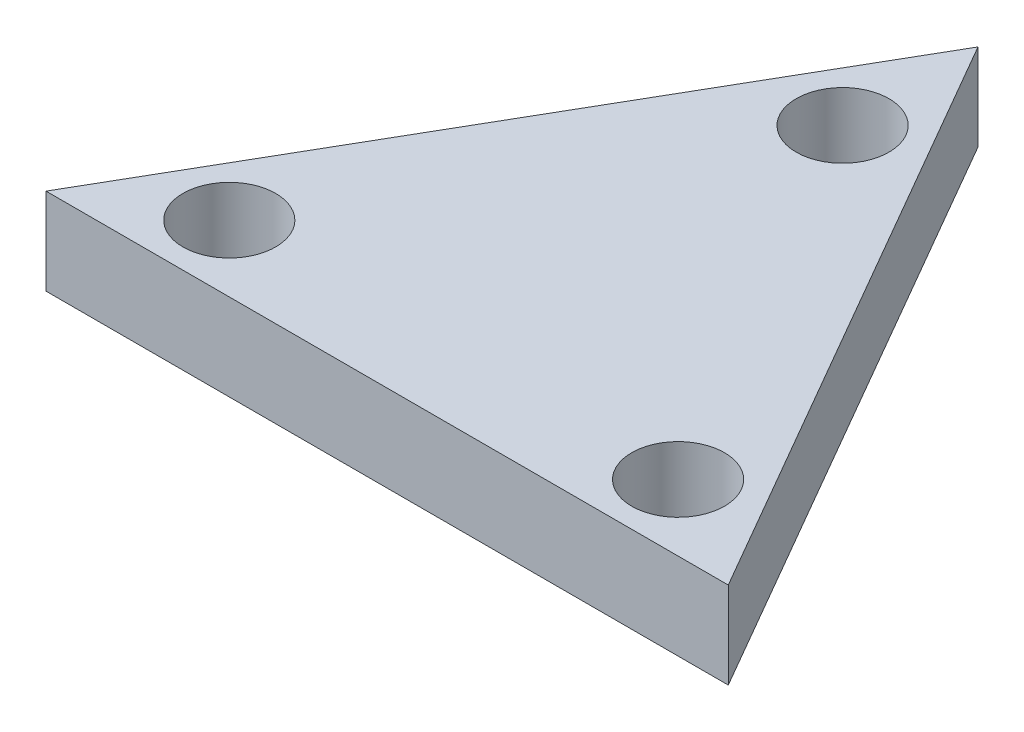
ISO-10303-21;
HEADER;
FILE_DESCRIPTION(('STEP AP214'),'2;1');
FILE_NAME('part.step','',(''),(''),'','','');
FILE_SCHEMA(('AUTOMOTIVE_DESIGN { 1 0 10303 214 1 1 1 1 }'));
ENDSEC;
DATA;
#1=APPLICATION_CONTEXT('core data for automotive mechanical design processes');
#2=APPLICATION_PROTOCOL_DEFINITION('international standard','automotive_design',2000,#1);
#3=PRODUCT_CONTEXT('',#1,'mechanical');
#4=PRODUCT('Part','Part','',(#3));
#5=PRODUCT_RELATED_PRODUCT_CATEGORY('part','',(#4));
#6=PRODUCT_DEFINITION_FORMATION('','',#4);
#7=PRODUCT_DEFINITION_CONTEXT('part definition',#1,'design');
#8=PRODUCT_DEFINITION('design','',#6,#7);
#9=PRODUCT_DEFINITION_SHAPE('','',#8);
#10=(LENGTH_UNIT() NAMED_UNIT(*) SI_UNIT(.MILLI.,.METRE.));
#11=(NAMED_UNIT(*) PLANE_ANGLE_UNIT() SI_UNIT($,.RADIAN.));
#12=(NAMED_UNIT(*) SI_UNIT($,.STERADIAN.) SOLID_ANGLE_UNIT());
#13=UNCERTAINTY_MEASURE_WITH_UNIT(LENGTH_MEASURE(1.E-05),#10,'distance_accuracy_value','');
#14=(GEOMETRIC_REPRESENTATION_CONTEXT(3) GLOBAL_UNCERTAINTY_ASSIGNED_CONTEXT((#13)) GLOBAL_UNIT_ASSIGNED_CONTEXT((#10,
#11,#12)) REPRESENTATION_CONTEXT('',''));
#15=CARTESIAN_POINT('',(0.,0.,0.));
#16=DIRECTION('',(0.,0.,1.));
#17=DIRECTION('',(1.,0.,0.));
#18=AXIS2_PLACEMENT_3D('',#15,#16,#17);
#19=CARTESIAN_POINT('',(12.4904092944218,3.175,6.34325313807528));
#20=DIRECTION('',(-0.866025403784439,0.,0.5));
#21=DIRECTION('',(0.5,0.,0.866025403784439));
#22=AXIS2_PLACEMENT_3D('',#19,#20,#21);
#23=PLANE('',#22);
#24=DIRECTION('',(-0.5,0.,-0.866025403784439));
#25=VECTOR('',#24,1.);
#26=CARTESIAN_POINT('',(12.4904092944218,0.,6.34325313807528));
#27=LINE('',#26,#25);
#28=CARTESIAN_POINT('',(12.4904092944218,0.,6.34325313807528));
#29=VERTEX_POINT('',#28);
#30=CARTESIAN_POINT('',(-0.00959070557821594,0.,-15.3073819565357));
#31=VERTEX_POINT('',#30);
#32=EDGE_CURVE('E88',#29,#31,#27,.T.);
#33=ORIENTED_EDGE('',*,*,#32,.T.);
#34=DIRECTION('',(0.,-1.,0.));
#35=VECTOR('',#34,1.);
#36=CARTESIAN_POINT('',(-0.00959070557821594,3.175,-15.3073819565357));
#37=LINE('',#36,#35);
#38=CARTESIAN_POINT('',(-0.00959070557821594,3.175,-15.3073819565357));
#39=VERTEX_POINT('',#38);
#40=EDGE_CURVE('E11',#39,#31,#37,.T.);
#41=ORIENTED_EDGE('',*,*,#40,.F.);
#42=DIRECTION('',(-0.5,0.,-0.866025403784439));
#43=VECTOR('',#42,1.);
#44=CARTESIAN_POINT('',(12.4904092944218,3.175,6.34325313807528));
#45=LINE('',#44,#43);
#46=CARTESIAN_POINT('',(12.4904092944218,3.175,6.34325313807528));
#47=VERTEX_POINT('',#46);
#48=EDGE_CURVE('E80',#47,#39,#45,.T.);
#49=ORIENTED_EDGE('',*,*,#48,.F.);
#50=DIRECTION('',(0.,-1.,0.));
#51=VECTOR('',#50,1.);
#52=CARTESIAN_POINT('',(12.4904092944218,3.175,6.34325313807528));
#53=LINE('',#52,#51);
#54=EDGE_CURVE('E89',#47,#29,#53,.T.);
#55=ORIENTED_EDGE('',*,*,#54,.T.);
#56=EDGE_LOOP('',(#33,#41,#49,#55));
#57=FACE_BOUND('',#56,.T.);
#58=ADVANCED_FACE('F38',(#57),#23,.F.);
#59=CARTESIAN_POINT('',(-0.00959070557821594,3.175,-15.3073819565357));
#60=DIRECTION('',(0.866025403784439,0.,0.5));
#61=DIRECTION('',(0.5,0.,-0.866025403784439));
#62=AXIS2_PLACEMENT_3D('',#59,#60,#61);
#63=PLANE('',#62);
#64=DIRECTION('',(-0.5,0.,0.866025403784439));
#65=VECTOR('',#64,1.);
#66=CARTESIAN_POINT('',(-0.00959070557821594,0.,-15.3073819565357));
#67=LINE('',#66,#65);
#68=CARTESIAN_POINT('',(-12.5095907055782,0.,6.34325313807528));
#69=VERTEX_POINT('',#68);
#70=EDGE_CURVE('E67',#31,#69,#67,.T.);
#71=ORIENTED_EDGE('',*,*,#70,.T.);
#72=DIRECTION('',(0.,-1.,0.));
#73=VECTOR('',#72,1.);
#74=CARTESIAN_POINT('',(-12.5095907055782,3.175,6.34325313807528));
#75=LINE('',#74,#73);
#76=CARTESIAN_POINT('',(-12.5095907055782,3.175,6.34325313807528));
#77=VERTEX_POINT('',#76);
#78=EDGE_CURVE('E47',#77,#69,#75,.T.);
#79=ORIENTED_EDGE('',*,*,#78,.F.);
#80=DIRECTION('',(-0.5,0.,0.866025403784439));
#81=VECTOR('',#80,1.);
#82=CARTESIAN_POINT('',(-0.00959070557821594,3.175,-15.3073819565357));
#83=LINE('',#82,#81);
#84=EDGE_CURVE('E75',#39,#77,#83,.T.);
#85=ORIENTED_EDGE('',*,*,#84,.F.);
#86=ORIENTED_EDGE('',*,*,#40,.T.);
#87=EDGE_LOOP('',(#71,#79,#85,#86));
#88=FACE_BOUND('',#87,.T.);
#89=ADVANCED_FACE('F76',(#88),#63,.F.);
#90=CARTESIAN_POINT('',(-12.5095907055782,3.175,6.34325313807528));
#91=DIRECTION('',(0.,0.,-1.));
#92=DIRECTION('',(-1.,0.,0.));
#93=AXIS2_PLACEMENT_3D('',#90,#91,#92);
#94=PLANE('',#93);
#95=DIRECTION('',(1.,0.,0.));
#96=VECTOR('',#95,1.);
#97=CARTESIAN_POINT('',(-12.5095907055782,0.,6.34325313807528));
#98=LINE('',#97,#96);
#99=EDGE_CURVE('E72',#69,#29,#98,.T.);
#100=ORIENTED_EDGE('',*,*,#99,.T.);
#101=ORIENTED_EDGE('',*,*,#54,.F.);
#102=DIRECTION('',(1.,0.,0.));
#103=VECTOR('',#102,1.);
#104=CARTESIAN_POINT('',(-12.5095907055782,3.175,6.34325313807528));
#105=LINE('',#104,#103);
#106=EDGE_CURVE('E55',#77,#47,#105,.T.);
#107=ORIENTED_EDGE('',*,*,#106,.F.);
#108=ORIENTED_EDGE('',*,*,#78,.T.);
#109=EDGE_LOOP('',(#100,#101,#107,#108));
#110=FACE_BOUND('',#109,.T.);
#111=ADVANCED_FACE('F106',(#110),#94,.F.);
#112=CARTESIAN_POINT('',(0.,3.175,0.));
#113=DIRECTION('',(0.,1.,0.));
#114=DIRECTION('',(0.,0.,1.));
#115=AXIS2_PLACEMENT_3D('',#112,#113,#114);
#116=PLANE('',#115);
#117=CARTESIAN_POINT('',(0.,3.175,-10.3362338651444));
#118=DIRECTION('',(0.,1.,0.));
#119=DIRECTION('',(0.,0.,1.));
#120=AXIS2_PLACEMENT_3D('',#117,#118,#119);
#121=CIRCLE('',#120,1.7);
#122=CARTESIAN_POINT('',(0.,3.175,-8.63623386514437));
#123=VERTEX_POINT('',#122);
#124=EDGE_CURVE('E98',#123,#123,#121,.T.);
#125=ORIENTED_EDGE('',*,*,#124,.F.);
#126=EDGE_LOOP('',(#125));
#127=FACE_BOUND('',#126,.T.);
#128=CARTESIAN_POINT('',(-8.22876437327352,3.175,3.90771000195734));
#129=DIRECTION('',(0.,1.,0.));
#130=DIRECTION('',(0.,0.,1.));
#131=AXIS2_PLACEMENT_3D('',#128,#129,#130);
#132=CIRCLE('',#131,1.7);
#133=CARTESIAN_POINT('',(-8.22876437327352,3.175,5.60771000195734));
#134=VERTEX_POINT('',#133);
#135=EDGE_CURVE('E178',#134,#134,#132,.T.);
#136=ORIENTED_EDGE('',*,*,#135,.F.);
#137=EDGE_LOOP('',(#136));
#138=FACE_BOUND('',#137,.T.);
#139=CARTESIAN_POINT('',(8.22123505235288,3.175,3.91205705741768));
#140=DIRECTION('',(0.,1.,0.));
#141=DIRECTION('',(0.,0.,1.));
#142=AXIS2_PLACEMENT_3D('',#139,#140,#141);
#143=CIRCLE('',#142,1.7);
#144=CARTESIAN_POINT('',(8.22123505235288,3.175,5.61205705741768));
#145=VERTEX_POINT('',#144);
#146=EDGE_CURVE('E188',#145,#145,#143,.T.);
#147=ORIENTED_EDGE('',*,*,#146,.F.);
#148=EDGE_LOOP('',(#147));
#149=FACE_BOUND('',#148,.T.);
#150=ORIENTED_EDGE('',*,*,#48,.T.);
#151=ORIENTED_EDGE('',*,*,#84,.T.);
#152=ORIENTED_EDGE('',*,*,#106,.T.);
#153=EDGE_LOOP('',(#150,#151,#152));
#154=FACE_BOUND('',#153,.T.);
#155=ADVANCED_FACE('F83',(#127,#138,#149,#154),#116,.T.);
#156=CARTESIAN_POINT('',(0.,0.,0.));
#157=DIRECTION('',(0.,1.,0.));
#158=DIRECTION('',(0.,0.,1.));
#159=AXIS2_PLACEMENT_3D('',#156,#157,#158);
#160=PLANE('',#159);
#161=CARTESIAN_POINT('',(0.,0.,-10.3362338651444));
#162=DIRECTION('',(0.,1.,0.));
#163=DIRECTION('',(0.,0.,1.));
#164=AXIS2_PLACEMENT_3D('',#161,#162,#163);
#165=CIRCLE('',#164,1.7);
#166=CARTESIAN_POINT('',(0.,0.,-8.63623386514437));
#167=VERTEX_POINT('',#166);
#168=EDGE_CURVE('E92',#167,#167,#165,.T.);
#169=ORIENTED_EDGE('',*,*,#168,.T.);
#170=EDGE_LOOP('',(#169));
#171=FACE_BOUND('',#170,.T.);
#172=CARTESIAN_POINT('',(-8.22876437327352,0.,3.90771000195734));
#173=DIRECTION('',(0.,1.,0.));
#174=DIRECTION('',(0.,0.,1.));
#175=AXIS2_PLACEMENT_3D('',#172,#173,#174);
#176=CIRCLE('',#175,1.7);
#177=CARTESIAN_POINT('',(-8.22876437327352,0.,5.60771000195734));
#178=VERTEX_POINT('',#177);
#179=EDGE_CURVE('E174',#178,#178,#176,.T.);
#180=ORIENTED_EDGE('',*,*,#179,.T.);
#181=EDGE_LOOP('',(#180));
#182=FACE_BOUND('',#181,.T.);
#183=CARTESIAN_POINT('',(8.22123505235288,0.,3.91205705741768));
#184=DIRECTION('',(0.,1.,0.));
#185=DIRECTION('',(0.,0.,1.));
#186=AXIS2_PLACEMENT_3D('',#183,#184,#185);
#187=CIRCLE('',#186,1.7);
#188=CARTESIAN_POINT('',(8.22123505235288,0.,5.61205705741768));
#189=VERTEX_POINT('',#188);
#190=EDGE_CURVE('E184',#189,#189,#187,.T.);
#191=ORIENTED_EDGE('',*,*,#190,.T.);
#192=EDGE_LOOP('',(#191));
#193=FACE_BOUND('',#192,.T.);
#194=ORIENTED_EDGE('',*,*,#32,.F.);
#195=ORIENTED_EDGE('',*,*,#99,.F.);
#196=ORIENTED_EDGE('',*,*,#70,.F.);
#197=EDGE_LOOP('',(#194,#195,#196));
#198=FACE_BOUND('',#197,.T.);
#199=ADVANCED_FACE('F107',(#171,#182,#193,#198),#160,.F.);
#200=CARTESIAN_POINT('',(8.22123505235288,0.,3.91205705741768));
#201=DIRECTION('',(0.,1.,0.));
#202=DIRECTION('',(0.,0.,1.));
#203=AXIS2_PLACEMENT_3D('',#200,#201,#202);
#204=CYLINDRICAL_SURFACE('',#203,1.7);
#205=ORIENTED_EDGE('',*,*,#190,.F.);
#206=EDGE_LOOP('',(#205));
#207=FACE_BOUND('',#206,.T.);
#208=ORIENTED_EDGE('',*,*,#146,.T.);
#209=EDGE_LOOP('',(#208));
#210=FACE_BOUND('',#209,.T.);
#211=ADVANCED_FACE('F109',(#207,#210),#204,.F.);
#212=CARTESIAN_POINT('',(-8.22876437327352,0.,3.90771000195734));
#213=DIRECTION('',(0.,1.,0.));
#214=DIRECTION('',(0.,0.,1.));
#215=AXIS2_PLACEMENT_3D('',#212,#213,#214);
#216=CYLINDRICAL_SURFACE('',#215,1.7);
#217=ORIENTED_EDGE('',*,*,#179,.F.);
#218=EDGE_LOOP('',(#217));
#219=FACE_BOUND('',#218,.T.);
#220=ORIENTED_EDGE('',*,*,#135,.T.);
#221=EDGE_LOOP('',(#220));
#222=FACE_BOUND('',#221,.T.);
#223=ADVANCED_FACE('F117',(#219,#222),#216,.F.);
#224=CARTESIAN_POINT('',(0.,0.,-10.3362338651444));
#225=DIRECTION('',(0.,1.,0.));
#226=DIRECTION('',(0.,0.,1.));
#227=AXIS2_PLACEMENT_3D('',#224,#225,#226);
#228=CYLINDRICAL_SURFACE('',#227,1.7);
#229=ORIENTED_EDGE('',*,*,#168,.F.);
#230=EDGE_LOOP('',(#229));
#231=FACE_BOUND('',#230,.T.);
#232=ORIENTED_EDGE('',*,*,#124,.T.);
#233=EDGE_LOOP('',(#232));
#234=FACE_BOUND('',#233,.T.);
#235=ADVANCED_FACE('F152',(#231,#234),#228,.F.);
#236=CLOSED_SHELL('',(#58,#89,#111,#155,#199,#211,#223,#235));
#237=MANIFOLD_SOLID_BREP('B2',#236);
#238=ADVANCED_BREP_SHAPE_REPRESENTATION('',(#18,#237),#14);
#239=SHAPE_DEFINITION_REPRESENTATION(#9,#238);
ENDSEC;
END-ISO-10303-21;
